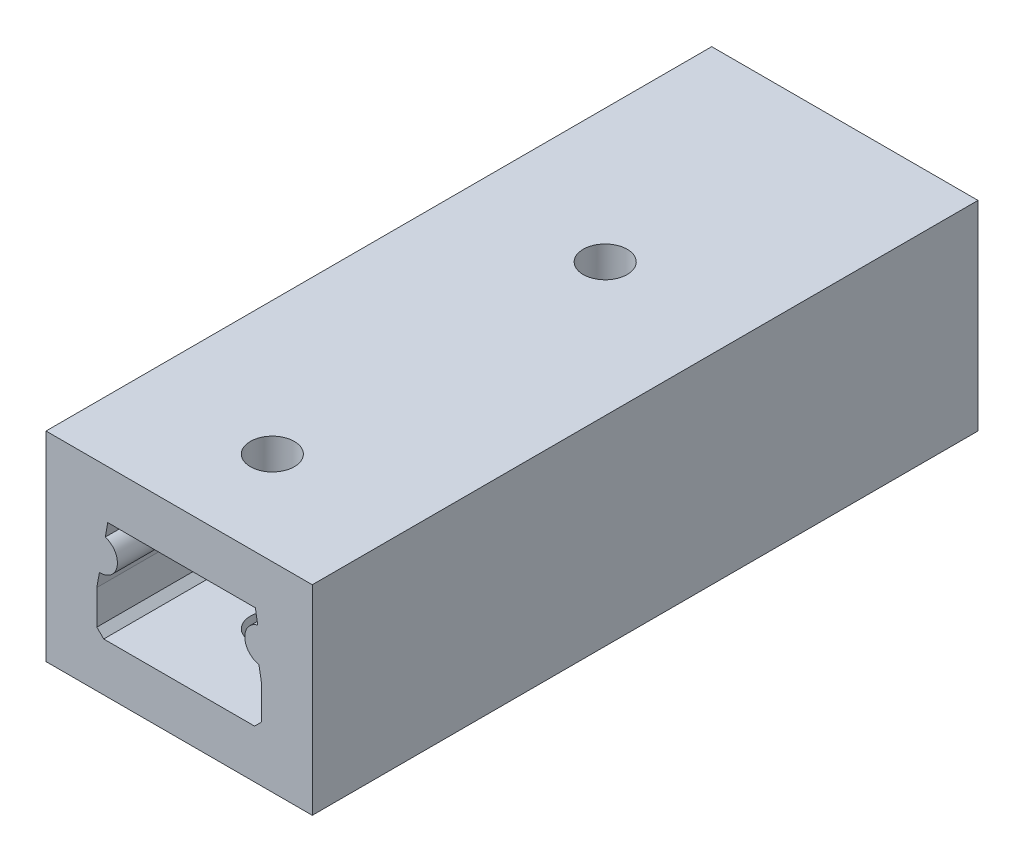
ISO-10303-21;
HEADER;
FILE_DESCRIPTION(('STEP AP214'),'2;1');
FILE_NAME('part.step','',(''),(''),'','','');
FILE_SCHEMA(('AUTOMOTIVE_DESIGN { 1 0 10303 214 1 1 1 1 }'));
ENDSEC;
DATA;
#1=APPLICATION_CONTEXT('core data for automotive mechanical design processes');
#2=APPLICATION_PROTOCOL_DEFINITION('international standard','automotive_design',2000,#1);
#3=PRODUCT_CONTEXT('',#1,'mechanical');
#4=PRODUCT('Part','Part','',(#3));
#5=PRODUCT_RELATED_PRODUCT_CATEGORY('part','',(#4));
#6=PRODUCT_DEFINITION_FORMATION('','',#4);
#7=PRODUCT_DEFINITION_CONTEXT('part definition',#1,'design');
#8=PRODUCT_DEFINITION('design','',#6,#7);
#9=PRODUCT_DEFINITION_SHAPE('','',#8);
#10=(LENGTH_UNIT() NAMED_UNIT(*) SI_UNIT(.MILLI.,.METRE.));
#11=(NAMED_UNIT(*) PLANE_ANGLE_UNIT() SI_UNIT($,.RADIAN.));
#12=(NAMED_UNIT(*) SI_UNIT($,.STERADIAN.) SOLID_ANGLE_UNIT());
#13=UNCERTAINTY_MEASURE_WITH_UNIT(LENGTH_MEASURE(1.E-05),#10,'distance_accuracy_value','');
#14=(GEOMETRIC_REPRESENTATION_CONTEXT(3) GLOBAL_UNCERTAINTY_ASSIGNED_CONTEXT((#13)) GLOBAL_UNIT_ASSIGNED_CONTEXT((#10,
#11,#12)) REPRESENTATION_CONTEXT('',''));
#15=CARTESIAN_POINT('',(0.,0.,0.));
#16=DIRECTION('',(0.,0.,1.));
#17=DIRECTION('',(1.,0.,0.));
#18=AXIS2_PLACEMENT_3D('',#15,#16,#17);
#19=CARTESIAN_POINT('',(0.,0.,50.));
#20=DIRECTION('',(0.,0.,-1.));
#21=DIRECTION('',(-1.,0.,0.));
#22=AXIS2_PLACEMENT_3D('',#19,#20,#21);
#23=PLANE('',#22);
#24=DIRECTION('',(0.,1.,0.));
#25=VECTOR('',#24,1.);
#26=CARTESIAN_POINT('',(10.,-3.75,50.));
#27=LINE('',#26,#25);
#28=CARTESIAN_POINT('',(10.,-3.75,50.));
#29=VERTEX_POINT('',#28);
#30=CARTESIAN_POINT('',(10.,11.25,50.));
#31=VERTEX_POINT('',#30);
#32=EDGE_CURVE('E292',#29,#31,#27,.T.);
#33=ORIENTED_EDGE('',*,*,#32,.T.);
#34=DIRECTION('',(-1.,0.,0.));
#35=VECTOR('',#34,1.);
#36=CARTESIAN_POINT('',(-10.,11.25,50.));
#37=LINE('',#36,#35);
#38=CARTESIAN_POINT('',(-10.,11.25,50.));
#39=VERTEX_POINT('',#38);
#40=EDGE_CURVE('E296',#31,#39,#37,.T.);
#41=ORIENTED_EDGE('',*,*,#40,.T.);
#42=DIRECTION('',(0.,-1.,0.));
#43=VECTOR('',#42,1.);
#44=CARTESIAN_POINT('',(-10.,-3.75,50.));
#45=LINE('',#44,#43);
#46=CARTESIAN_POINT('',(-10.,-3.75,50.));
#47=VERTEX_POINT('',#46);
#48=EDGE_CURVE('E300',#39,#47,#45,.T.);
#49=ORIENTED_EDGE('',*,*,#48,.T.);
#50=DIRECTION('',(1.,0.,0.));
#51=VECTOR('',#50,1.);
#52=CARTESIAN_POINT('',(-10.,-3.75,50.));
#53=LINE('',#52,#51);
#54=EDGE_CURVE('E303',#47,#29,#53,.T.);
#55=ORIENTED_EDGE('',*,*,#54,.T.);
#56=EDGE_LOOP('',(#33,#41,#49,#55));
#57=FACE_BOUND('',#56,.T.);
#58=DIRECTION('',(0.707106781186548,0.707106781186547,0.));
#59=VECTOR('',#58,1.);
#60=CARTESIAN_POINT('',(5.665,-0.1125,50.));
#61=LINE('',#60,#59);
#62=CARTESIAN_POINT('',(5.665,-0.1125,50.));
#63=VERTEX_POINT('',#62);
#64=CARTESIAN_POINT('',(6.18,0.4025,50.));
#65=VERTEX_POINT('',#64);
#66=EDGE_CURVE('E161',#63,#65,#61,.T.);
#67=ORIENTED_EDGE('',*,*,#66,.F.);
#68=DIRECTION('',(1.,0.,0.));
#69=VECTOR('',#68,1.);
#70=CARTESIAN_POINT('',(-5.665,-0.1125,50.));
#71=LINE('',#70,#69);
#72=CARTESIAN_POINT('',(-5.665,-0.1125,50.));
#73=VERTEX_POINT('',#72);
#74=EDGE_CURVE('E215',#73,#63,#71,.T.);
#75=ORIENTED_EDGE('',*,*,#74,.F.);
#76=DIRECTION('',(0.707106781186548,-0.707106781186547,0.));
#77=VECTOR('',#76,1.);
#78=CARTESIAN_POINT('',(-6.18,0.4025,50.));
#79=LINE('',#78,#77);
#80=CARTESIAN_POINT('',(-6.18,0.4025,50.));
#81=VERTEX_POINT('',#80);
#82=EDGE_CURVE('E212',#81,#73,#79,.T.);
#83=ORIENTED_EDGE('',*,*,#82,.F.);
#84=DIRECTION('',(0.,-1.,0.));
#85=VECTOR('',#84,1.);
#86=CARTESIAN_POINT('',(-6.18,2.9775,50.));
#87=LINE('',#86,#85);
#88=CARTESIAN_POINT('',(-6.18,2.9775,50.));
#89=VERTEX_POINT('',#88);
#90=EDGE_CURVE('E209',#89,#81,#87,.T.);
#91=ORIENTED_EDGE('',*,*,#90,.F.);
#92=DIRECTION('',(-0.173648177666919,-0.98480775301221,0.));
#93=VECTOR('',#92,1.);
#94=CARTESIAN_POINT('',(-5.98899935383237,4.0607184921458,50.));
#95=LINE('',#94,#93);
#96=CARTESIAN_POINT('',(-5.98899935383237,4.06071849214581,50.));
#97=VERTEX_POINT('',#96);
#98=EDGE_CURVE('E206',#97,#89,#95,.T.);
#99=ORIENTED_EDGE('',*,*,#98,.F.);
#100=CARTESIAN_POINT('',(-5.92249999999993,5.3465,50.));
#101=DIRECTION('',(0.,0.,-1.));
#102=DIRECTION('',(1.,0.,0.));
#103=AXIS2_PLACEMENT_3D('',#100,#101,#102);
#104=CIRCLE('',#103,1.28749999999997);
#105=CARTESIAN_POINT('',(-5.54522577648146,6.57748351340237,50.));
#106=VERTEX_POINT('',#105);
#107=EDGE_CURVE('E203',#106,#97,#104,.T.);
#108=ORIENTED_EDGE('',*,*,#107,.F.);
#109=DIRECTION('',(-0.17364817766689,-0.984807753012215,0.));
#110=VECTOR('',#109,1.);
#111=CARTESIAN_POINT('',(-5.36272444441626,7.6125,50.));
#112=LINE('',#111,#110);
#113=CARTESIAN_POINT('',(-5.36272444441626,7.6125,50.));
#114=VERTEX_POINT('',#113);
#115=EDGE_CURVE('E200',#114,#106,#112,.T.);
#116=ORIENTED_EDGE('',*,*,#115,.F.);
#117=DIRECTION('',(-1.,0.,0.));
#118=VECTOR('',#117,1.);
#119=CARTESIAN_POINT('',(5.72272444441626,7.6125,50.));
#120=LINE('',#119,#118);
#121=CARTESIAN_POINT('',(5.72272444441626,7.6125,50.));
#122=VERTEX_POINT('',#121);
#123=EDGE_CURVE('E197',#122,#114,#120,.T.);
#124=ORIENTED_EDGE('',*,*,#123,.F.);
#125=DIRECTION('',(-0.173648177666889,0.984807753012215,0.));
#126=VECTOR('',#125,1.);
#127=CARTESIAN_POINT('',(5.90522577648145,6.57748351340238,50.));
#128=LINE('',#127,#126);
#129=CARTESIAN_POINT('',(5.90522577648145,6.57748351340238,50.));
#130=VERTEX_POINT('',#129);
#131=EDGE_CURVE('E194',#130,#122,#128,.T.);
#132=ORIENTED_EDGE('',*,*,#131,.F.);
#133=CARTESIAN_POINT('',(6.21599005199749,5.32805091615556,50.));
#134=DIRECTION('',(0.,0.,-1.));
#135=DIRECTION('',(1.,0.,0.));
#136=AXIS2_PLACEMENT_3D('',#133,#134,#135);
#137=CIRCLE('',#136,1.28749999999998);
#138=CARTESIAN_POINT('',(5.98899935383237,4.06071849214579,50.));
#139=VERTEX_POINT('',#138);
#140=EDGE_CURVE('E188',#139,#130,#137,.T.);
#141=ORIENTED_EDGE('',*,*,#140,.F.);
#142=DIRECTION('',(-0.17364817766692,0.98480775301221,0.));
#143=VECTOR('',#142,1.);
#144=CARTESIAN_POINT('',(6.18,2.9775,50.));
#145=LINE('',#144,#143);
#146=CARTESIAN_POINT('',(6.18,2.9775,50.));
#147=VERTEX_POINT('',#146);
#148=EDGE_CURVE('E184',#147,#139,#145,.T.);
#149=ORIENTED_EDGE('',*,*,#148,.F.);
#150=DIRECTION('',(0.,1.,0.));
#151=VECTOR('',#150,1.);
#152=CARTESIAN_POINT('',(6.18,0.4025,50.));
#153=LINE('',#152,#151);
#154=EDGE_CURVE('E170',#65,#147,#153,.T.);
#155=ORIENTED_EDGE('',*,*,#154,.F.);
#156=EDGE_LOOP('',(#67,#75,#83,#91,#99,#108,#116,#124,#132,#141,#149,#155));
#157=FACE_BOUND('',#156,.T.);
#158=ADVANCED_FACE('F45',(#57,#157),#23,.F.);
#159=CARTESIAN_POINT('',(0.,0.,0.));
#160=DIRECTION('',(0.,0.,-1.));
#161=DIRECTION('',(-1.,0.,0.));
#162=AXIS2_PLACEMENT_3D('',#159,#160,#161);
#163=PLANE('',#162);
#164=DIRECTION('',(0.,1.,0.));
#165=VECTOR('',#164,1.);
#166=CARTESIAN_POINT('',(10.,-3.75,0.));
#167=LINE('',#166,#165);
#168=CARTESIAN_POINT('',(10.,-3.75,0.));
#169=VERTEX_POINT('',#168);
#170=CARTESIAN_POINT('',(10.,11.25,0.));
#171=VERTEX_POINT('',#170);
#172=EDGE_CURVE('E179',#169,#171,#167,.T.);
#173=ORIENTED_EDGE('',*,*,#172,.F.);
#174=DIRECTION('',(1.,0.,0.));
#175=VECTOR('',#174,1.);
#176=CARTESIAN_POINT('',(-10.,-3.75,0.));
#177=LINE('',#176,#175);
#178=CARTESIAN_POINT('',(-10.,-3.75,0.));
#179=VERTEX_POINT('',#178);
#180=EDGE_CURVE('E297',#179,#169,#177,.T.);
#181=ORIENTED_EDGE('',*,*,#180,.F.);
#182=DIRECTION('',(0.,-1.,0.));
#183=VECTOR('',#182,1.);
#184=CARTESIAN_POINT('',(-10.,-3.75,0.));
#185=LINE('',#184,#183);
#186=CARTESIAN_POINT('',(-10.,11.25,0.));
#187=VERTEX_POINT('',#186);
#188=EDGE_CURVE('E313',#187,#179,#185,.T.);
#189=ORIENTED_EDGE('',*,*,#188,.F.);
#190=DIRECTION('',(-1.,0.,0.));
#191=VECTOR('',#190,1.);
#192=CARTESIAN_POINT('',(-10.,11.25,0.));
#193=LINE('',#192,#191);
#194=EDGE_CURVE('E310',#171,#187,#193,.T.);
#195=ORIENTED_EDGE('',*,*,#194,.F.);
#196=EDGE_LOOP('',(#173,#181,#189,#195));
#197=FACE_BOUND('',#196,.T.);
#198=DIRECTION('',(1.,0.,0.));
#199=VECTOR('',#198,1.);
#200=CARTESIAN_POINT('',(-5.665,-0.1125,0.));
#201=LINE('',#200,#199);
#202=CARTESIAN_POINT('',(-5.665,-0.1125,0.));
#203=VERTEX_POINT('',#202);
#204=CARTESIAN_POINT('',(5.665,-0.1125,0.));
#205=VERTEX_POINT('',#204);
#206=EDGE_CURVE('E171',#203,#205,#201,.T.);
#207=ORIENTED_EDGE('',*,*,#206,.T.);
#208=DIRECTION('',(0.707106781186548,0.707106781186547,0.));
#209=VECTOR('',#208,1.);
#210=CARTESIAN_POINT('',(5.665,-0.1125,0.));
#211=LINE('',#210,#209);
#212=CARTESIAN_POINT('',(6.18,0.4025,0.));
#213=VERTEX_POINT('',#212);
#214=EDGE_CURVE('E71',#205,#213,#211,.T.);
#215=ORIENTED_EDGE('',*,*,#214,.T.);
#216=DIRECTION('',(0.,1.,0.));
#217=VECTOR('',#216,1.);
#218=CARTESIAN_POINT('',(6.18,0.4025,0.));
#219=LINE('',#218,#217);
#220=CARTESIAN_POINT('',(6.18,2.9775,0.));
#221=VERTEX_POINT('',#220);
#222=EDGE_CURVE('E177',#213,#221,#219,.T.);
#223=ORIENTED_EDGE('',*,*,#222,.T.);
#224=DIRECTION('',(-0.17364817766692,0.98480775301221,0.));
#225=VECTOR('',#224,1.);
#226=CARTESIAN_POINT('',(6.18,2.9775,0.));
#227=LINE('',#226,#225);
#228=CARTESIAN_POINT('',(5.98899935383237,4.06071849214579,0.));
#229=VERTEX_POINT('',#228);
#230=EDGE_CURVE('E223',#221,#229,#227,.T.);
#231=ORIENTED_EDGE('',*,*,#230,.T.);
#232=CARTESIAN_POINT('',(6.21599005199749,5.32805091615556,0.));
#233=DIRECTION('',(0.,0.,-1.));
#234=DIRECTION('',(1.,0.,0.));
#235=AXIS2_PLACEMENT_3D('',#232,#233,#234);
#236=CIRCLE('',#235,1.28749999999998);
#237=CARTESIAN_POINT('',(5.90522577648145,6.57748351340238,0.));
#238=VERTEX_POINT('',#237);
#239=EDGE_CURVE('E227',#229,#238,#236,.T.);
#240=ORIENTED_EDGE('',*,*,#239,.T.);
#241=DIRECTION('',(-0.173648177666889,0.984807753012215,0.));
#242=VECTOR('',#241,1.);
#243=CARTESIAN_POINT('',(5.90522577648145,6.57748351340238,0.));
#244=LINE('',#243,#242);
#245=CARTESIAN_POINT('',(5.72272444441626,7.6125,0.));
#246=VERTEX_POINT('',#245);
#247=EDGE_CURVE('E231',#238,#246,#244,.T.);
#248=ORIENTED_EDGE('',*,*,#247,.T.);
#249=DIRECTION('',(-1.,0.,0.));
#250=VECTOR('',#249,1.);
#251=CARTESIAN_POINT('',(5.72272444441626,7.6125,0.));
#252=LINE('',#251,#250);
#253=CARTESIAN_POINT('',(-5.36272444441626,7.6125,0.));
#254=VERTEX_POINT('',#253);
#255=EDGE_CURVE('E235',#246,#254,#252,.T.);
#256=ORIENTED_EDGE('',*,*,#255,.T.);
#257=DIRECTION('',(-0.17364817766689,-0.984807753012215,0.));
#258=VECTOR('',#257,1.);
#259=CARTESIAN_POINT('',(-5.36272444441626,7.6125,0.));
#260=LINE('',#259,#258);
#261=CARTESIAN_POINT('',(-5.54522577648146,6.57748351340237,0.));
#262=VERTEX_POINT('',#261);
#263=EDGE_CURVE('E239',#254,#262,#260,.T.);
#264=ORIENTED_EDGE('',*,*,#263,.T.);
#265=CARTESIAN_POINT('',(-5.92249999999993,5.3465,0.));
#266=DIRECTION('',(0.,0.,-1.));
#267=DIRECTION('',(1.,0.,0.));
#268=AXIS2_PLACEMENT_3D('',#265,#266,#267);
#269=CIRCLE('',#268,1.28749999999997);
#270=CARTESIAN_POINT('',(-5.98899935383237,4.06071849214581,0.));
#271=VERTEX_POINT('',#270);
#272=EDGE_CURVE('E243',#262,#271,#269,.T.);
#273=ORIENTED_EDGE('',*,*,#272,.T.);
#274=DIRECTION('',(-0.173648177666919,-0.98480775301221,0.));
#275=VECTOR('',#274,1.);
#276=CARTESIAN_POINT('',(-5.98899935383237,4.0607184921458,0.));
#277=LINE('',#276,#275);
#278=CARTESIAN_POINT('',(-6.18,2.9775,0.));
#279=VERTEX_POINT('',#278);
#280=EDGE_CURVE('E247',#271,#279,#277,.T.);
#281=ORIENTED_EDGE('',*,*,#280,.T.);
#282=DIRECTION('',(0.,-1.,0.));
#283=VECTOR('',#282,1.);
#284=CARTESIAN_POINT('',(-6.18,2.9775,0.));
#285=LINE('',#284,#283);
#286=CARTESIAN_POINT('',(-6.18,0.4025,0.));
#287=VERTEX_POINT('',#286);
#288=EDGE_CURVE('E251',#279,#287,#285,.T.);
#289=ORIENTED_EDGE('',*,*,#288,.T.);
#290=DIRECTION('',(0.707106781186548,-0.707106781186547,0.));
#291=VECTOR('',#290,1.);
#292=CARTESIAN_POINT('',(-6.18,0.4025,0.));
#293=LINE('',#292,#291);
#294=EDGE_CURVE('E255',#287,#203,#293,.T.);
#295=ORIENTED_EDGE('',*,*,#294,.T.);
#296=EDGE_LOOP('',(#207,#215,#223,#231,#240,#248,#256,#264,#273,#281,#289,#295));
#297=FACE_BOUND('',#296,.T.);
#298=ADVANCED_FACE('F373',(#197,#297),#163,.T.);
#299=CARTESIAN_POINT('',(10.,-3.75,50.));
#300=DIRECTION('',(-1.,0.,0.));
#301=DIRECTION('',(0.,0.,1.));
#302=AXIS2_PLACEMENT_3D('',#299,#300,#301);
#303=PLANE('',#302);
#304=ORIENTED_EDGE('',*,*,#172,.T.);
#305=DIRECTION('',(0.,0.,-1.));
#306=VECTOR('',#305,1.);
#307=CARTESIAN_POINT('',(10.,11.25,50.));
#308=LINE('',#307,#306);
#309=EDGE_CURVE('E11',#31,#171,#308,.T.);
#310=ORIENTED_EDGE('',*,*,#309,.F.);
#311=ORIENTED_EDGE('',*,*,#32,.F.);
#312=DIRECTION('',(0.,0.,-1.));
#313=VECTOR('',#312,1.);
#314=CARTESIAN_POINT('',(10.,-3.75,50.));
#315=LINE('',#314,#313);
#316=EDGE_CURVE('E306',#29,#169,#315,.T.);
#317=ORIENTED_EDGE('',*,*,#316,.T.);
#318=EDGE_LOOP('',(#304,#310,#311,#317));
#319=FACE_BOUND('',#318,.T.);
#320=ADVANCED_FACE('F47',(#319),#303,.F.);
#321=CARTESIAN_POINT('',(-10.,11.25,50.));
#322=DIRECTION('',(0.,-1.,0.));
#323=DIRECTION('',(0.,0.,-1.));
#324=AXIS2_PLACEMENT_3D('',#321,#322,#323);
#325=PLANE('',#324);
#326=CARTESIAN_POINT('',(0.,11.25,18.));
#327=DIRECTION('',(0.,1.,0.));
#328=DIRECTION('',(0.,0.,1.));
#329=AXIS2_PLACEMENT_3D('',#326,#327,#328);
#330=CIRCLE('',#329,1.65);
#331=CARTESIAN_POINT('',(0.,11.25,19.65));
#332=VERTEX_POINT('',#331);
#333=EDGE_CURVE('E339',#332,#332,#330,.T.);
#334=ORIENTED_EDGE('',*,*,#333,.F.);
#335=EDGE_LOOP('',(#334));
#336=FACE_BOUND('',#335,.T.);
#337=CARTESIAN_POINT('',(0.,11.25,43.));
#338=DIRECTION('',(0.,1.,0.));
#339=DIRECTION('',(0.,0.,1.));
#340=AXIS2_PLACEMENT_3D('',#337,#338,#339);
#341=CIRCLE('',#340,1.65);
#342=CARTESIAN_POINT('',(0.,11.25,44.65));
#343=VERTEX_POINT('',#342);
#344=EDGE_CURVE('E345',#343,#343,#341,.T.);
#345=ORIENTED_EDGE('',*,*,#344,.F.);
#346=EDGE_LOOP('',(#345));
#347=FACE_BOUND('',#346,.T.);
#348=ORIENTED_EDGE('',*,*,#194,.T.);
#349=DIRECTION('',(0.,0.,-1.));
#350=VECTOR('',#349,1.);
#351=CARTESIAN_POINT('',(-10.,11.25,50.));
#352=LINE('',#351,#350);
#353=EDGE_CURVE('E55',#39,#187,#352,.T.);
#354=ORIENTED_EDGE('',*,*,#353,.F.);
#355=ORIENTED_EDGE('',*,*,#40,.F.);
#356=ORIENTED_EDGE('',*,*,#309,.T.);
#357=EDGE_LOOP('',(#348,#354,#355,#356));
#358=FACE_BOUND('',#357,.T.);
#359=ADVANCED_FACE('F437',(#336,#347,#358),#325,.F.);
#360=CARTESIAN_POINT('',(-10.,-3.75,50.));
#361=DIRECTION('',(1.,0.,0.));
#362=DIRECTION('',(0.,0.,-1.));
#363=AXIS2_PLACEMENT_3D('',#360,#361,#362);
#364=PLANE('',#363);
#365=ORIENTED_EDGE('',*,*,#188,.T.);
#366=DIRECTION('',(0.,0.,-1.));
#367=VECTOR('',#366,1.);
#368=CARTESIAN_POINT('',(-10.,-3.75,50.));
#369=LINE('',#368,#367);
#370=EDGE_CURVE('E321',#47,#179,#369,.T.);
#371=ORIENTED_EDGE('',*,*,#370,.F.);
#372=ORIENTED_EDGE('',*,*,#48,.F.);
#373=ORIENTED_EDGE('',*,*,#353,.T.);
#374=EDGE_LOOP('',(#365,#371,#372,#373));
#375=FACE_BOUND('',#374,.T.);
#376=ADVANCED_FACE('F435',(#375),#364,.F.);
#377=CARTESIAN_POINT('',(-10.,-3.75,50.));
#378=DIRECTION('',(0.,1.,0.));
#379=DIRECTION('',(0.,0.,1.));
#380=AXIS2_PLACEMENT_3D('',#377,#378,#379);
#381=PLANE('',#380);
#382=CARTESIAN_POINT('',(0.,-3.75,18.));
#383=DIRECTION('',(0.,1.,0.));
#384=DIRECTION('',(0.,0.,1.));
#385=AXIS2_PLACEMENT_3D('',#382,#383,#384);
#386=CIRCLE('',#385,1.65);
#387=CARTESIAN_POINT('',(0.,-3.75,19.65));
#388=VERTEX_POINT('',#387);
#389=EDGE_CURVE('E331',#388,#388,#386,.T.);
#390=ORIENTED_EDGE('',*,*,#389,.T.);
#391=EDGE_LOOP('',(#390));
#392=FACE_BOUND('',#391,.T.);
#393=CARTESIAN_POINT('',(0.,-3.75,43.));
#394=DIRECTION('',(0.,1.,0.));
#395=DIRECTION('',(0.,0.,1.));
#396=AXIS2_PLACEMENT_3D('',#393,#394,#395);
#397=CIRCLE('',#396,1.65);
#398=CARTESIAN_POINT('',(0.,-3.75,44.65));
#399=VERTEX_POINT('',#398);
#400=EDGE_CURVE('E351',#399,#399,#397,.T.);
#401=ORIENTED_EDGE('',*,*,#400,.T.);
#402=EDGE_LOOP('',(#401));
#403=FACE_BOUND('',#402,.T.);
#404=ORIENTED_EDGE('',*,*,#180,.T.);
#405=ORIENTED_EDGE('',*,*,#316,.F.);
#406=ORIENTED_EDGE('',*,*,#54,.F.);
#407=ORIENTED_EDGE('',*,*,#370,.T.);
#408=EDGE_LOOP('',(#404,#405,#406,#407));
#409=FACE_BOUND('',#408,.T.);
#410=ADVANCED_FACE('F432',(#392,#403,#409),#381,.F.);
#411=CARTESIAN_POINT('',(5.665,-0.1125,50.));
#412=DIRECTION('',(-0.707106781186547,0.707106781186548,0.));
#413=DIRECTION('',(-0.707106781186548,-0.707106781186547,0.));
#414=AXIS2_PLACEMENT_3D('',#411,#412,#413);
#415=PLANE('',#414);
#416=ORIENTED_EDGE('',*,*,#214,.F.);
#417=DIRECTION('',(0.,0.,-1.));
#418=VECTOR('',#417,1.);
#419=CARTESIAN_POINT('',(5.665,-0.1125,50.));
#420=LINE('',#419,#418);
#421=EDGE_CURVE('E165',#63,#205,#420,.T.);
#422=ORIENTED_EDGE('',*,*,#421,.F.);
#423=ORIENTED_EDGE('',*,*,#66,.T.);
#424=DIRECTION('',(0.,0.,-1.));
#425=VECTOR('',#424,1.);
#426=CARTESIAN_POINT('',(6.18,0.4025,50.));
#427=LINE('',#426,#425);
#428=EDGE_CURVE('E164',#65,#213,#427,.T.);
#429=ORIENTED_EDGE('',*,*,#428,.T.);
#430=EDGE_LOOP('',(#416,#422,#423,#429));
#431=FACE_BOUND('',#430,.T.);
#432=ADVANCED_FACE('F163',(#431),#415,.T.);
#433=CARTESIAN_POINT('',(6.18,0.4025,50.));
#434=DIRECTION('',(-1.,0.,0.));
#435=DIRECTION('',(0.,0.,1.));
#436=AXIS2_PLACEMENT_3D('',#433,#434,#435);
#437=PLANE('',#436);
#438=ORIENTED_EDGE('',*,*,#222,.F.);
#439=ORIENTED_EDGE('',*,*,#428,.F.);
#440=ORIENTED_EDGE('',*,*,#154,.T.);
#441=DIRECTION('',(0.,0.,-1.));
#442=VECTOR('',#441,1.);
#443=CARTESIAN_POINT('',(6.18,2.9775,50.));
#444=LINE('',#443,#442);
#445=EDGE_CURVE('E180',#147,#221,#444,.T.);
#446=ORIENTED_EDGE('',*,*,#445,.T.);
#447=EDGE_LOOP('',(#438,#439,#440,#446));
#448=FACE_BOUND('',#447,.T.);
#449=ADVANCED_FACE('F174',(#448),#437,.T.);
#450=CARTESIAN_POINT('',(6.18,2.9775,50.));
#451=DIRECTION('',(-0.98480775301221,-0.17364817766692,0.));
#452=DIRECTION('',(0.17364817766692,-0.98480775301221,0.));
#453=AXIS2_PLACEMENT_3D('',#450,#451,#452);
#454=PLANE('',#453);
#455=ORIENTED_EDGE('',*,*,#230,.F.);
#456=ORIENTED_EDGE('',*,*,#445,.F.);
#457=ORIENTED_EDGE('',*,*,#148,.T.);
#458=DIRECTION('',(0.,0.,-1.));
#459=VECTOR('',#458,1.);
#460=CARTESIAN_POINT('',(5.98899935383237,4.06071849214579,50.));
#461=LINE('',#460,#459);
#462=EDGE_CURVE('E287',#139,#229,#461,.T.);
#463=ORIENTED_EDGE('',*,*,#462,.T.);
#464=EDGE_LOOP('',(#455,#456,#457,#463));
#465=FACE_BOUND('',#464,.T.);
#466=ADVANCED_FACE('F413',(#465),#454,.T.);
#467=CARTESIAN_POINT('',(6.21599005199749,5.32805091615556,50.));
#468=DIRECTION('',(0.,0.,-1.));
#469=DIRECTION('',(-1.,0.,0.));
#470=AXIS2_PLACEMENT_3D('',#467,#468,#469);
#471=CYLINDRICAL_SURFACE('',#470,1.28749999999998);
#472=ORIENTED_EDGE('',*,*,#239,.F.);
#473=ORIENTED_EDGE('',*,*,#462,.F.);
#474=ORIENTED_EDGE('',*,*,#140,.T.);
#475=DIRECTION('',(0.,0.,-1.));
#476=VECTOR('',#475,1.);
#477=CARTESIAN_POINT('',(5.90522577648145,6.57748351340238,50.));
#478=LINE('',#477,#476);
#479=EDGE_CURVE('E284',#130,#238,#478,.T.);
#480=ORIENTED_EDGE('',*,*,#479,.T.);
#481=EDGE_LOOP('',(#472,#473,#474,#480));
#482=FACE_BOUND('',#481,.T.);
#483=ADVANCED_FACE('F410',(#482),#471,.T.);
#484=CARTESIAN_POINT('',(5.90522577648145,6.57748351340238,50.));
#485=DIRECTION('',(-0.984807753012215,-0.173648177666889,0.));
#486=DIRECTION('',(0.173648177666889,-0.984807753012215,0.));
#487=AXIS2_PLACEMENT_3D('',#484,#485,#486);
#488=PLANE('',#487);
#489=ORIENTED_EDGE('',*,*,#247,.F.);
#490=ORIENTED_EDGE('',*,*,#479,.F.);
#491=ORIENTED_EDGE('',*,*,#131,.T.);
#492=DIRECTION('',(0.,0.,-1.));
#493=VECTOR('',#492,1.);
#494=CARTESIAN_POINT('',(5.72272444441626,7.6125,50.));
#495=LINE('',#494,#493);
#496=EDGE_CURVE('E281',#122,#246,#495,.T.);
#497=ORIENTED_EDGE('',*,*,#496,.T.);
#498=EDGE_LOOP('',(#489,#490,#491,#497));
#499=FACE_BOUND('',#498,.T.);
#500=ADVANCED_FACE('F405',(#499),#488,.T.);
#501=CARTESIAN_POINT('',(5.72272444441626,7.6125,50.));
#502=DIRECTION('',(0.,-1.,0.));
#503=DIRECTION('',(0.,0.,-1.));
#504=AXIS2_PLACEMENT_3D('',#501,#502,#503);
#505=PLANE('',#504);
#506=CARTESIAN_POINT('',(0.,7.6125,18.));
#507=DIRECTION('',(0.,-1.,0.));
#508=DIRECTION('',(0.,0.,-1.));
#509=AXIS2_PLACEMENT_3D('',#506,#507,#508);
#510=CIRCLE('',#509,1.65);
#511=CARTESIAN_POINT('',(0.,7.6125,16.35));
#512=VERTEX_POINT('',#511);
#513=EDGE_CURVE('E220',#512,#512,#510,.T.);
#514=ORIENTED_EDGE('',*,*,#513,.F.);
#515=EDGE_LOOP('',(#514));
#516=FACE_BOUND('',#515,.T.);
#517=CARTESIAN_POINT('',(0.,7.6125,43.));
#518=DIRECTION('',(0.,-1.,0.));
#519=DIRECTION('',(0.,0.,-1.));
#520=AXIS2_PLACEMENT_3D('',#517,#518,#519);
#521=CIRCLE('',#520,1.65);
#522=CARTESIAN_POINT('',(0.,7.6125,41.35));
#523=VERTEX_POINT('',#522);
#524=EDGE_CURVE('E330',#523,#523,#521,.T.);
#525=ORIENTED_EDGE('',*,*,#524,.F.);
#526=EDGE_LOOP('',(#525));
#527=FACE_BOUND('',#526,.T.);
#528=ORIENTED_EDGE('',*,*,#255,.F.);
#529=ORIENTED_EDGE('',*,*,#496,.F.);
#530=ORIENTED_EDGE('',*,*,#123,.T.);
#531=DIRECTION('',(0.,0.,-1.));
#532=VECTOR('',#531,1.);
#533=CARTESIAN_POINT('',(-5.36272444441626,7.6125,50.));
#534=LINE('',#533,#532);
#535=EDGE_CURVE('E278',#114,#254,#534,.T.);
#536=ORIENTED_EDGE('',*,*,#535,.T.);
#537=EDGE_LOOP('',(#528,#529,#530,#536));
#538=FACE_BOUND('',#537,.T.);
#539=ADVANCED_FACE('F401',(#516,#527,#538),#505,.T.);
#540=CARTESIAN_POINT('',(-5.36272444441626,7.6125,50.));
#541=DIRECTION('',(0.984807753012215,-0.17364817766689,0.));
#542=DIRECTION('',(0.17364817766689,0.984807753012215,0.));
#543=AXIS2_PLACEMENT_3D('',#540,#541,#542);
#544=PLANE('',#543);
#545=ORIENTED_EDGE('',*,*,#263,.F.);
#546=ORIENTED_EDGE('',*,*,#535,.F.);
#547=ORIENTED_EDGE('',*,*,#115,.T.);
#548=DIRECTION('',(0.,0.,-1.));
#549=VECTOR('',#548,1.);
#550=CARTESIAN_POINT('',(-5.54522577648146,6.57748351340237,50.));
#551=LINE('',#550,#549);
#552=EDGE_CURVE('E275',#106,#262,#551,.T.);
#553=ORIENTED_EDGE('',*,*,#552,.T.);
#554=EDGE_LOOP('',(#545,#546,#547,#553));
#555=FACE_BOUND('',#554,.T.);
#556=ADVANCED_FACE('F398',(#555),#544,.T.);
#557=CARTESIAN_POINT('',(-5.92249999999993,5.3465,50.));
#558=DIRECTION('',(0.,0.,-1.));
#559=DIRECTION('',(-1.,0.,0.));
#560=AXIS2_PLACEMENT_3D('',#557,#558,#559);
#561=CYLINDRICAL_SURFACE('',#560,1.28749999999997);
#562=ORIENTED_EDGE('',*,*,#272,.F.);
#563=ORIENTED_EDGE('',*,*,#552,.F.);
#564=ORIENTED_EDGE('',*,*,#107,.T.);
#565=DIRECTION('',(0.,0.,-1.));
#566=VECTOR('',#565,1.);
#567=CARTESIAN_POINT('',(-5.98899935383237,4.06071849214581,50.));
#568=LINE('',#567,#566);
#569=EDGE_CURVE('E272',#97,#271,#568,.T.);
#570=ORIENTED_EDGE('',*,*,#569,.T.);
#571=EDGE_LOOP('',(#562,#563,#564,#570));
#572=FACE_BOUND('',#571,.T.);
#573=ADVANCED_FACE('F390',(#572),#561,.T.);
#574=CARTESIAN_POINT('',(-5.98899935383237,4.0607184921458,50.));
#575=DIRECTION('',(0.98480775301221,-0.173648177666919,0.));
#576=DIRECTION('',(0.173648177666919,0.98480775301221,0.));
#577=AXIS2_PLACEMENT_3D('',#574,#575,#576);
#578=PLANE('',#577);
#579=ORIENTED_EDGE('',*,*,#280,.F.);
#580=ORIENTED_EDGE('',*,*,#569,.F.);
#581=ORIENTED_EDGE('',*,*,#98,.T.);
#582=DIRECTION('',(0.,0.,-1.));
#583=VECTOR('',#582,1.);
#584=CARTESIAN_POINT('',(-6.18,2.9775,50.));
#585=LINE('',#584,#583);
#586=EDGE_CURVE('E269',#89,#279,#585,.T.);
#587=ORIENTED_EDGE('',*,*,#586,.T.);
#588=EDGE_LOOP('',(#579,#580,#581,#587));
#589=FACE_BOUND('',#588,.T.);
#590=ADVANCED_FACE('F386',(#589),#578,.T.);
#591=CARTESIAN_POINT('',(-6.18,2.9775,50.));
#592=DIRECTION('',(1.,0.,0.));
#593=DIRECTION('',(0.,0.,-1.));
#594=AXIS2_PLACEMENT_3D('',#591,#592,#593);
#595=PLANE('',#594);
#596=ORIENTED_EDGE('',*,*,#288,.F.);
#597=ORIENTED_EDGE('',*,*,#586,.F.);
#598=ORIENTED_EDGE('',*,*,#90,.T.);
#599=DIRECTION('',(0.,0.,-1.));
#600=VECTOR('',#599,1.);
#601=CARTESIAN_POINT('',(-6.18,0.4025,50.));
#602=LINE('',#601,#600);
#603=EDGE_CURVE('E266',#81,#287,#602,.T.);
#604=ORIENTED_EDGE('',*,*,#603,.T.);
#605=EDGE_LOOP('',(#596,#597,#598,#604));
#606=FACE_BOUND('',#605,.T.);
#607=ADVANCED_FACE('F383',(#606),#595,.T.);
#608=CARTESIAN_POINT('',(-6.18,0.4025,50.));
#609=DIRECTION('',(0.707106781186547,0.707106781186548,0.));
#610=DIRECTION('',(-0.707106781186548,0.707106781186547,0.));
#611=AXIS2_PLACEMENT_3D('',#608,#609,#610);
#612=PLANE('',#611);
#613=ORIENTED_EDGE('',*,*,#294,.F.);
#614=ORIENTED_EDGE('',*,*,#603,.F.);
#615=ORIENTED_EDGE('',*,*,#82,.T.);
#616=DIRECTION('',(0.,0.,-1.));
#617=VECTOR('',#616,1.);
#618=CARTESIAN_POINT('',(-5.665,-0.1125,50.));
#619=LINE('',#618,#617);
#620=EDGE_CURVE('E63',#73,#203,#619,.T.);
#621=ORIENTED_EDGE('',*,*,#620,.T.);
#622=EDGE_LOOP('',(#613,#614,#615,#621));
#623=FACE_BOUND('',#622,.T.);
#624=ADVANCED_FACE('F369',(#623),#612,.T.);
#625=CARTESIAN_POINT('',(-5.665,-0.1125,50.));
#626=DIRECTION('',(0.,1.,0.));
#627=DIRECTION('',(0.,0.,1.));
#628=AXIS2_PLACEMENT_3D('',#625,#626,#627);
#629=PLANE('',#628);
#630=CARTESIAN_POINT('',(0.,-0.1125,18.));
#631=DIRECTION('',(0.,1.,0.));
#632=DIRECTION('',(0.,0.,1.));
#633=AXIS2_PLACEMENT_3D('',#630,#631,#632);
#634=CIRCLE('',#633,1.65);
#635=CARTESIAN_POINT('',(0.,-0.1125,19.65));
#636=VERTEX_POINT('',#635);
#637=EDGE_CURVE('E49',#636,#636,#634,.T.);
#638=ORIENTED_EDGE('',*,*,#637,.F.);
#639=EDGE_LOOP('',(#638));
#640=FACE_BOUND('',#639,.T.);
#641=CARTESIAN_POINT('',(0.,-0.1125,43.));
#642=DIRECTION('',(0.,1.,0.));
#643=DIRECTION('',(0.,0.,1.));
#644=AXIS2_PLACEMENT_3D('',#641,#642,#643);
#645=CIRCLE('',#644,1.65);
#646=CARTESIAN_POINT('',(0.,-0.1125,44.65));
#647=VERTEX_POINT('',#646);
#648=EDGE_CURVE('E327',#647,#647,#645,.T.);
#649=ORIENTED_EDGE('',*,*,#648,.F.);
#650=EDGE_LOOP('',(#649));
#651=FACE_BOUND('',#650,.T.);
#652=ORIENTED_EDGE('',*,*,#206,.F.);
#653=ORIENTED_EDGE('',*,*,#620,.F.);
#654=ORIENTED_EDGE('',*,*,#74,.T.);
#655=ORIENTED_EDGE('',*,*,#421,.T.);
#656=EDGE_LOOP('',(#652,#653,#654,#655));
#657=FACE_BOUND('',#656,.T.);
#658=ADVANCED_FACE('F365',(#640,#651,#657),#629,.T.);
#659=CARTESIAN_POINT('',(0.,-3.75,43.));
#660=DIRECTION('',(0.,1.,0.));
#661=DIRECTION('',(0.,0.,1.));
#662=AXIS2_PLACEMENT_3D('',#659,#660,#661);
#663=CYLINDRICAL_SURFACE('',#662,1.65);
#664=ORIENTED_EDGE('',*,*,#648,.T.);
#665=EDGE_LOOP('',(#664));
#666=FACE_BOUND('',#665,.T.);
#667=ORIENTED_EDGE('',*,*,#400,.F.);
#668=EDGE_LOOP('',(#667));
#669=FACE_BOUND('',#668,.T.);
#670=ADVANCED_FACE('F368',(#666,#669),#663,.F.);
#671=CARTESIAN_POINT('',(0.,-3.75,18.));
#672=DIRECTION('',(0.,1.,0.));
#673=DIRECTION('',(0.,0.,1.));
#674=AXIS2_PLACEMENT_3D('',#671,#672,#673);
#675=CYLINDRICAL_SURFACE('',#674,1.65);
#676=ORIENTED_EDGE('',*,*,#637,.T.);
#677=EDGE_LOOP('',(#676));
#678=FACE_BOUND('',#677,.T.);
#679=ORIENTED_EDGE('',*,*,#389,.F.);
#680=EDGE_LOOP('',(#679));
#681=FACE_BOUND('',#680,.T.);
#682=ADVANCED_FACE('F362',(#678,#681),#675,.F.);
#683=ORIENTED_EDGE('',*,*,#524,.T.);
#684=EDGE_LOOP('',(#683));
#685=FACE_BOUND('',#684,.T.);
#686=ORIENTED_EDGE('',*,*,#344,.T.);
#687=EDGE_LOOP('',(#686));
#688=FACE_BOUND('',#687,.T.);
#689=ADVANCED_FACE('F462',(#685,#688),#663,.F.);
#690=ORIENTED_EDGE('',*,*,#513,.T.);
#691=EDGE_LOOP('',(#690));
#692=FACE_BOUND('',#691,.T.);
#693=ORIENTED_EDGE('',*,*,#333,.T.);
#694=EDGE_LOOP('',(#693));
#695=FACE_BOUND('',#694,.T.);
#696=ADVANCED_FACE('F464',(#692,#695),#675,.F.);
#697=CLOSED_SHELL('',(#158,#298,#320,#359,#376,#410,#432,#449,#466,#483,#500,#539,#556,#573,
#590,#607,#624,#658,#670,#682,#689,#696));
#698=MANIFOLD_SOLID_BREP('B2',#697);
#699=ADVANCED_BREP_SHAPE_REPRESENTATION('',(#18,#698),#14);
#700=SHAPE_DEFINITION_REPRESENTATION(#9,#699);
ENDSEC;
END-ISO-10303-21;
